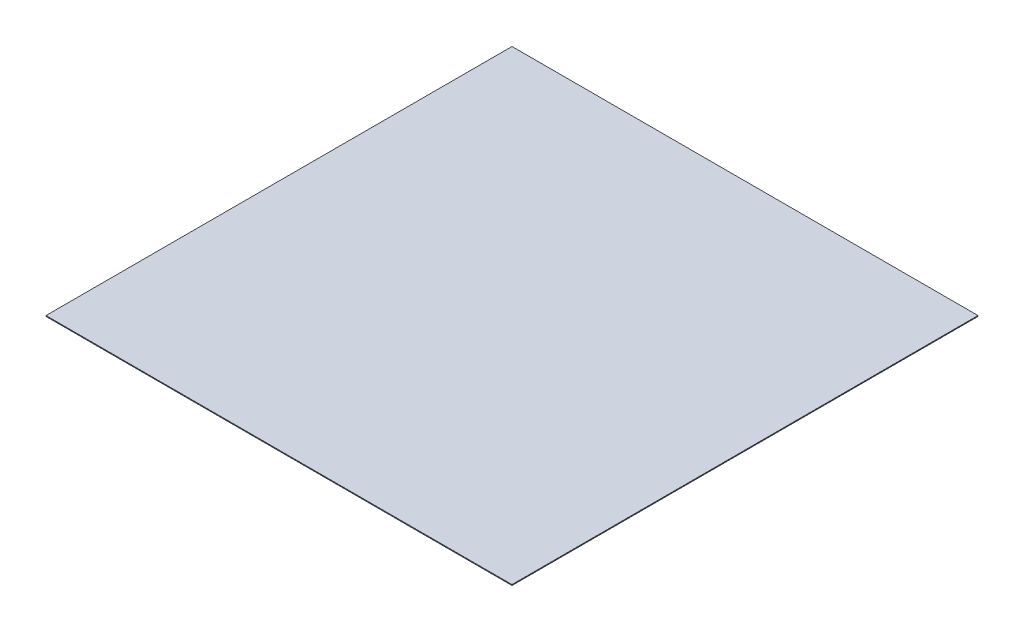
ISO-10303-21;
HEADER;
FILE_DESCRIPTION(('STEP AP214'),'2;1');
FILE_NAME('part.step','',(''),(''),'','','');
FILE_SCHEMA(('AUTOMOTIVE_DESIGN { 1 0 10303 214 1 1 1 1 }'));
ENDSEC;
DATA;
#1=APPLICATION_CONTEXT('core data for automotive mechanical design processes');
#2=APPLICATION_PROTOCOL_DEFINITION('international standard','automotive_design',2000,#1);
#3=PRODUCT_CONTEXT('',#1,'mechanical');
#4=PRODUCT('Part','Part','',(#3));
#5=PRODUCT_RELATED_PRODUCT_CATEGORY('part','',(#4));
#6=PRODUCT_DEFINITION_FORMATION('','',#4);
#7=PRODUCT_DEFINITION_CONTEXT('part definition',#1,'design');
#8=PRODUCT_DEFINITION('design','',#6,#7);
#9=PRODUCT_DEFINITION_SHAPE('','',#8);
#10=(LENGTH_UNIT() NAMED_UNIT(*) SI_UNIT(.MILLI.,.METRE.));
#11=(NAMED_UNIT(*) PLANE_ANGLE_UNIT() SI_UNIT($,.RADIAN.));
#12=(NAMED_UNIT(*) SI_UNIT($,.STERADIAN.) SOLID_ANGLE_UNIT());
#13=UNCERTAINTY_MEASURE_WITH_UNIT(LENGTH_MEASURE(1.E-05),#10,'distance_accuracy_value','');
#14=(GEOMETRIC_REPRESENTATION_CONTEXT(3) GLOBAL_UNCERTAINTY_ASSIGNED_CONTEXT((#13)) GLOBAL_UNIT_ASSIGNED_CONTEXT((#10,
#11,#12)) REPRESENTATION_CONTEXT('',''));
#15=CARTESIAN_POINT('',(0.,0.,0.));
#16=DIRECTION('',(0.,0.,1.));
#17=DIRECTION('',(1.,0.,0.));
#18=AXIS2_PLACEMENT_3D('',#15,#16,#17);
#19=CARTESIAN_POINT('',(282.842712474619,1.,282.842712474619));
#20=DIRECTION('',(-1.,0.,0.));
#21=DIRECTION('',(0.,0.,1.));
#22=AXIS2_PLACEMENT_3D('',#19,#20,#21);
#23=PLANE('',#22);
#24=DIRECTION('',(0.,0.,-1.));
#25=VECTOR('',#24,1.);
#26=CARTESIAN_POINT('',(282.842712474619,0.,282.842712474619));
#27=LINE('',#26,#25);
#28=CARTESIAN_POINT('',(282.842712474619,0.,282.842712474619));
#29=VERTEX_POINT('',#28);
#30=CARTESIAN_POINT('',(282.842712474619,0.,-282.842712474619));
#31=VERTEX_POINT('',#30);
#32=EDGE_CURVE('E113',#29,#31,#27,.T.);
#33=ORIENTED_EDGE('',*,*,#32,.T.);
#34=DIRECTION('',(0.,-1.,0.));
#35=VECTOR('',#34,1.);
#36=CARTESIAN_POINT('',(282.842712474619,1.,-282.842712474619));
#37=LINE('',#36,#35);
#38=CARTESIAN_POINT('',(282.842712474619,1.,-282.842712474619));
#39=VERTEX_POINT('',#38);
#40=EDGE_CURVE('E11',#39,#31,#37,.T.);
#41=ORIENTED_EDGE('',*,*,#40,.F.);
#42=DIRECTION('',(0.,0.,-1.));
#43=VECTOR('',#42,1.);
#44=CARTESIAN_POINT('',(282.842712474619,1.,282.842712474619));
#45=LINE('',#44,#43);
#46=CARTESIAN_POINT('',(282.842712474619,1.,282.842712474619));
#47=VERTEX_POINT('',#46);
#48=EDGE_CURVE('E97',#47,#39,#45,.T.);
#49=ORIENTED_EDGE('',*,*,#48,.F.);
#50=DIRECTION('',(0.,-1.,0.));
#51=VECTOR('',#50,1.);
#52=CARTESIAN_POINT('',(282.842712474619,1.,282.842712474619));
#53=LINE('',#52,#51);
#54=EDGE_CURVE('E109',#47,#29,#53,.T.);
#55=ORIENTED_EDGE('',*,*,#54,.T.);
#56=EDGE_LOOP('',(#33,#41,#49,#55));
#57=FACE_BOUND('',#56,.T.);
#58=ADVANCED_FACE('F45',(#57),#23,.F.);
#59=CARTESIAN_POINT('',(-282.842712474619,1.,-282.842712474619));
#60=DIRECTION('',(0.,0.,1.));
#61=DIRECTION('',(1.,0.,0.));
#62=AXIS2_PLACEMENT_3D('',#59,#60,#61);
#63=PLANE('',#62);
#64=DIRECTION('',(-1.,0.,0.));
#65=VECTOR('',#64,1.);
#66=CARTESIAN_POINT('',(-282.842712474619,0.,-282.842712474619));
#67=LINE('',#66,#65);
#68=CARTESIAN_POINT('',(-282.842712474619,0.,-282.842712474619));
#69=VERTEX_POINT('',#68);
#70=EDGE_CURVE('E102',#31,#69,#67,.T.);
#71=ORIENTED_EDGE('',*,*,#70,.T.);
#72=DIRECTION('',(0.,-1.,0.));
#73=VECTOR('',#72,1.);
#74=CARTESIAN_POINT('',(-282.842712474619,1.,-282.842712474619));
#75=LINE('',#74,#73);
#76=CARTESIAN_POINT('',(-282.842712474619,1.,-282.842712474619));
#77=VERTEX_POINT('',#76);
#78=EDGE_CURVE('E54',#77,#69,#75,.T.);
#79=ORIENTED_EDGE('',*,*,#78,.F.);
#80=DIRECTION('',(-1.,0.,0.));
#81=VECTOR('',#80,1.);
#82=CARTESIAN_POINT('',(-282.842712474619,1.,-282.842712474619));
#83=LINE('',#82,#81);
#84=EDGE_CURVE('E92',#39,#77,#83,.T.);
#85=ORIENTED_EDGE('',*,*,#84,.F.);
#86=ORIENTED_EDGE('',*,*,#40,.T.);
#87=EDGE_LOOP('',(#71,#79,#85,#86));
#88=FACE_BOUND('',#87,.T.);
#89=ADVANCED_FACE('F101',(#88),#63,.F.);
#90=CARTESIAN_POINT('',(-282.842712474619,1.,282.842712474619));
#91=DIRECTION('',(1.,0.,0.));
#92=DIRECTION('',(0.,0.,-1.));
#93=AXIS2_PLACEMENT_3D('',#90,#91,#92);
#94=PLANE('',#93);
#95=DIRECTION('',(0.,0.,1.));
#96=VECTOR('',#95,1.);
#97=CARTESIAN_POINT('',(-282.842712474619,0.,282.842712474619));
#98=LINE('',#97,#96);
#99=CARTESIAN_POINT('',(-282.842712474619,0.,282.842712474619));
#100=VERTEX_POINT('',#99);
#101=EDGE_CURVE('E79',#69,#100,#98,.T.);
#102=ORIENTED_EDGE('',*,*,#101,.T.);
#103=DIRECTION('',(0.,-1.,0.));
#104=VECTOR('',#103,1.);
#105=CARTESIAN_POINT('',(-282.842712474619,1.,282.842712474619));
#106=LINE('',#105,#104);
#107=CARTESIAN_POINT('',(-282.842712474619,1.,282.842712474619));
#108=VERTEX_POINT('',#107);
#109=EDGE_CURVE('E104',#108,#100,#106,.T.);
#110=ORIENTED_EDGE('',*,*,#109,.F.);
#111=DIRECTION('',(0.,0.,1.));
#112=VECTOR('',#111,1.);
#113=CARTESIAN_POINT('',(-282.842712474619,1.,282.842712474619));
#114=LINE('',#113,#112);
#115=EDGE_CURVE('E95',#77,#108,#114,.T.);
#116=ORIENTED_EDGE('',*,*,#115,.F.);
#117=ORIENTED_EDGE('',*,*,#78,.T.);
#118=EDGE_LOOP('',(#102,#110,#116,#117));
#119=FACE_BOUND('',#118,.T.);
#120=ADVANCED_FACE('F105',(#119),#94,.F.);
#121=CARTESIAN_POINT('',(-282.842712474619,1.,282.842712474619));
#122=DIRECTION('',(0.,0.,-1.));
#123=DIRECTION('',(-1.,0.,0.));
#124=AXIS2_PLACEMENT_3D('',#121,#122,#123);
#125=PLANE('',#124);
#126=DIRECTION('',(1.,0.,0.));
#127=VECTOR('',#126,1.);
#128=CARTESIAN_POINT('',(-282.842712474619,0.,282.842712474619));
#129=LINE('',#128,#127);
#130=EDGE_CURVE('E85',#100,#29,#129,.T.);
#131=ORIENTED_EDGE('',*,*,#130,.T.);
#132=ORIENTED_EDGE('',*,*,#54,.F.);
#133=DIRECTION('',(1.,0.,0.));
#134=VECTOR('',#133,1.);
#135=CARTESIAN_POINT('',(-282.842712474619,1.,282.842712474619));
#136=LINE('',#135,#134);
#137=EDGE_CURVE('E62',#108,#47,#136,.T.);
#138=ORIENTED_EDGE('',*,*,#137,.F.);
#139=ORIENTED_EDGE('',*,*,#109,.T.);
#140=EDGE_LOOP('',(#131,#132,#138,#139));
#141=FACE_BOUND('',#140,.T.);
#142=ADVANCED_FACE('F126',(#141),#125,.F.);
#143=CARTESIAN_POINT('',(0.,1.,0.));
#144=DIRECTION('',(0.,-1.,0.));
#145=DIRECTION('',(0.,0.,-1.));
#146=AXIS2_PLACEMENT_3D('',#143,#144,#145);
#147=PLANE('',#146);
#148=ORIENTED_EDGE('',*,*,#48,.T.);
#149=ORIENTED_EDGE('',*,*,#84,.T.);
#150=ORIENTED_EDGE('',*,*,#115,.T.);
#151=ORIENTED_EDGE('',*,*,#137,.T.);
#152=EDGE_LOOP('',(#148,#149,#150,#151));
#153=FACE_BOUND('',#152,.T.);
#154=ADVANCED_FACE('F93',(#153),#147,.F.);
#155=CARTESIAN_POINT('',(0.,0.,0.));
#156=DIRECTION('',(0.,-1.,0.));
#157=DIRECTION('',(0.,0.,-1.));
#158=AXIS2_PLACEMENT_3D('',#155,#156,#157);
#159=PLANE('',#158);
#160=ORIENTED_EDGE('',*,*,#32,.F.);
#161=ORIENTED_EDGE('',*,*,#130,.F.);
#162=ORIENTED_EDGE('',*,*,#101,.F.);
#163=ORIENTED_EDGE('',*,*,#70,.F.);
#164=EDGE_LOOP('',(#160,#161,#162,#163));
#165=FACE_BOUND('',#164,.T.);
#166=ADVANCED_FACE('F129',(#165),#159,.T.);
#167=CLOSED_SHELL('',(#58,#89,#120,#142,#154,#166));
#168=MANIFOLD_SOLID_BREP('B2',#167);
#169=ADVANCED_BREP_SHAPE_REPRESENTATION('',(#18,#168),#14);
#170=SHAPE_DEFINITION_REPRESENTATION(#9,#169);
ENDSEC;
END-ISO-10303-21;
